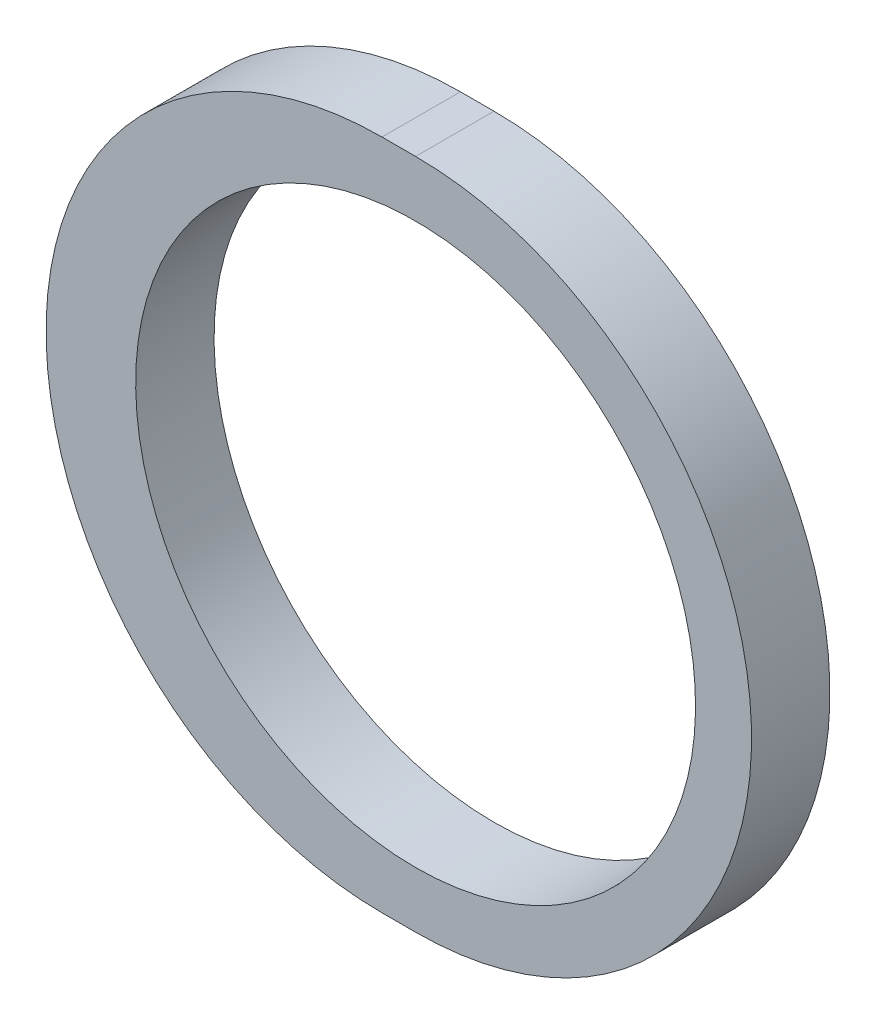
ISO-10303-21;
HEADER;
FILE_DESCRIPTION(('STEP AP214'),'2;1');
FILE_NAME('part.step','',(''),(''),'','','');
FILE_SCHEMA(('AUTOMOTIVE_DESIGN { 1 0 10303 214 1 1 1 1 }'));
ENDSEC;
DATA;
#1=APPLICATION_CONTEXT('core data for automotive mechanical design processes');
#2=APPLICATION_PROTOCOL_DEFINITION('international standard','automotive_design',2000,#1);
#3=PRODUCT_CONTEXT('',#1,'mechanical');
#4=PRODUCT('Part','Part','',(#3));
#5=PRODUCT_RELATED_PRODUCT_CATEGORY('part','',(#4));
#6=PRODUCT_DEFINITION_FORMATION('','',#4);
#7=PRODUCT_DEFINITION_CONTEXT('part definition',#1,'design');
#8=PRODUCT_DEFINITION('design','',#6,#7);
#9=PRODUCT_DEFINITION_SHAPE('','',#8);
#10=(LENGTH_UNIT() NAMED_UNIT(*) SI_UNIT(.MILLI.,.METRE.));
#11=(NAMED_UNIT(*) PLANE_ANGLE_UNIT() SI_UNIT($,.RADIAN.));
#12=(NAMED_UNIT(*) SI_UNIT($,.STERADIAN.) SOLID_ANGLE_UNIT());
#13=UNCERTAINTY_MEASURE_WITH_UNIT(LENGTH_MEASURE(1.E-05),#10,'distance_accuracy_value','');
#14=(GEOMETRIC_REPRESENTATION_CONTEXT(3) GLOBAL_UNCERTAINTY_ASSIGNED_CONTEXT((#13)) GLOBAL_UNIT_ASSIGNED_CONTEXT((#10,
#11,#12)) REPRESENTATION_CONTEXT('',''));
#15=CARTESIAN_POINT('',(0.,0.,0.));
#16=DIRECTION('',(0.,0.,1.));
#17=DIRECTION('',(1.,0.,0.));
#18=AXIS2_PLACEMENT_3D('',#15,#16,#17);
#19=CARTESIAN_POINT('',(90.9,-132.68,-0.045));
#20=DIRECTION('',(0.,0.,-1.));
#21=DIRECTION('',(0.,-1.,0.));
#22=AXIS2_PLACEMENT_3D('',#19,#20,#21);
#23=CYLINDRICAL_SURFACE('',#22,0.125);
#24=CARTESIAN_POINT('',(90.9,-132.68,-0.035));
#25=DIRECTION('',(0.,0.,-1.));
#26=DIRECTION('',(0.,-1.,0.));
#27=AXIS2_PLACEMENT_3D('',#24,#25,#26);
#28=CIRCLE('',#27,0.125);
#29=CARTESIAN_POINT('',(90.9,-132.805,-0.035));
#30=VERTEX_POINT('',#29);
#31=EDGE_CURVE('E122',#30,#30,#28,.T.);
#32=ORIENTED_EDGE('',*,*,#31,.T.);
#33=DIRECTION('',(0.,0.,1.));
#34=VECTOR('',#33,1.);
#35=CARTESIAN_POINT('',(90.9,-132.805,-0.045));
#36=LINE('',#35,#34);
#37=CARTESIAN_POINT('',(90.9,-132.805,0.));
#38=VERTEX_POINT('',#37);
#39=EDGE_CURVE('E11',#30,#38,#36,.T.);
#40=ORIENTED_EDGE('',*,*,#39,.T.);
#41=CARTESIAN_POINT('',(90.9,-132.68,0.));
#42=DIRECTION('',(0.,0.,-1.));
#43=DIRECTION('',(0.,-1.,0.));
#44=AXIS2_PLACEMENT_3D('',#41,#42,#43);
#45=CIRCLE('',#44,0.125);
#46=EDGE_CURVE('E26',#38,#38,#45,.T.);
#47=ORIENTED_EDGE('',*,*,#46,.F.);
#48=ORIENTED_EDGE('',*,*,#39,.F.);
#49=EDGE_LOOP('',(#32,#40,#47,#48));
#50=FACE_BOUND('',#49,.T.);
#51=ADVANCED_FACE('F17',(#50),#23,.F.);
#52=CARTESIAN_POINT('',(90.885,-132.83,-0.035));
#53=DIRECTION('',(0.,1.,0.));
#54=DIRECTION('',(1.,0.,0.));
#55=AXIS2_PLACEMENT_3D('',#52,#53,#54);
#56=PLANE('',#55);
#57=DIRECTION('',(1.,0.,0.));
#58=VECTOR('',#57,1.);
#59=CARTESIAN_POINT('',(90.885,-132.83,-0.035));
#60=LINE('',#59,#58);
#61=CARTESIAN_POINT('',(90.885,-132.83,-0.035));
#62=VERTEX_POINT('',#61);
#63=CARTESIAN_POINT('',(90.9,-132.83,-0.035));
#64=VERTEX_POINT('',#63);
#65=EDGE_CURVE('E59',#62,#64,#60,.T.);
#66=ORIENTED_EDGE('',*,*,#65,.T.);
#67=DIRECTION('',(0.,0.,1.));
#68=VECTOR('',#67,1.);
#69=CARTESIAN_POINT('',(90.9,-132.83,-0.035));
#70=LINE('',#69,#68);
#71=CARTESIAN_POINT('',(90.9,-132.83,0.));
#72=VERTEX_POINT('',#71);
#73=EDGE_CURVE('E91',#64,#72,#70,.T.);
#74=ORIENTED_EDGE('',*,*,#73,.T.);
#75=DIRECTION('',(1.,0.,0.));
#76=VECTOR('',#75,1.);
#77=CARTESIAN_POINT('',(90.885,-132.83,0.));
#78=LINE('',#77,#76);
#79=CARTESIAN_POINT('',(90.885,-132.83,0.));
#80=VERTEX_POINT('',#79);
#81=EDGE_CURVE('E49',#80,#72,#78,.T.);
#82=ORIENTED_EDGE('',*,*,#81,.F.);
#83=DIRECTION('',(0.,0.,1.));
#84=VECTOR('',#83,1.);
#85=CARTESIAN_POINT('',(90.885,-132.83,-0.035));
#86=LINE('',#85,#84);
#87=EDGE_CURVE('E126',#62,#80,#86,.T.);
#88=ORIENTED_EDGE('',*,*,#87,.F.);
#89=EDGE_LOOP('',(#66,#74,#82,#88));
#90=FACE_BOUND('',#89,.T.);
#91=ADVANCED_FACE('F155',(#90),#56,.F.);
#92=CARTESIAN_POINT('',(90.9,-132.53,0.));
#93=DIRECTION('',(0.,0.,1.));
#94=DIRECTION('',(1.,0.,0.));
#95=AXIS2_PLACEMENT_3D('',#92,#93,#94);
#96=PLANE('',#95);
#97=ORIENTED_EDGE('',*,*,#46,.T.);
#98=EDGE_LOOP('',(#97));
#99=FACE_BOUND('',#98,.T.);
#100=DIRECTION('',(-1.,0.,0.));
#101=VECTOR('',#100,1.);
#102=CARTESIAN_POINT('',(90.9,-132.53,0.));
#103=LINE('',#102,#101);
#104=CARTESIAN_POINT('',(90.9,-132.53,0.));
#105=VERTEX_POINT('',#104);
#106=CARTESIAN_POINT('',(90.885,-132.53,0.));
#107=VERTEX_POINT('',#106);
#108=EDGE_CURVE('E102',#105,#107,#103,.T.);
#109=ORIENTED_EDGE('',*,*,#108,.T.);
#110=CARTESIAN_POINT('',(90.885,-132.68,0.));
#111=DIRECTION('',(0.,0.,1.));
#112=DIRECTION('',(0.,1.,0.));
#113=AXIS2_PLACEMENT_3D('',#110,#111,#112);
#114=CIRCLE('',#113,0.15);
#115=EDGE_CURVE('E130',#107,#80,#114,.T.);
#116=ORIENTED_EDGE('',*,*,#115,.T.);
#117=ORIENTED_EDGE('',*,*,#81,.T.);
#118=CARTESIAN_POINT('',(90.9,-132.68,0.));
#119=DIRECTION('',(0.,0.,1.));
#120=DIRECTION('',(0.,-1.,0.));
#121=AXIS2_PLACEMENT_3D('',#118,#119,#120);
#122=CIRCLE('',#121,0.15);
#123=EDGE_CURVE('E94',#72,#105,#122,.T.);
#124=ORIENTED_EDGE('',*,*,#123,.T.);
#125=EDGE_LOOP('',(#109,#116,#117,#124));
#126=FACE_BOUND('',#125,.T.);
#127=ADVANCED_FACE('F145',(#99,#126),#96,.T.);
#128=CARTESIAN_POINT('',(90.9,-132.53,-0.035));
#129=DIRECTION('',(0.,0.,1.));
#130=DIRECTION('',(1.,0.,0.));
#131=AXIS2_PLACEMENT_3D('',#128,#129,#130);
#132=PLANE('',#131);
#133=ORIENTED_EDGE('',*,*,#31,.F.);
#134=EDGE_LOOP('',(#133));
#135=FACE_BOUND('',#134,.T.);
#136=CARTESIAN_POINT('',(90.9,-132.68,-0.035));
#137=DIRECTION('',(0.,0.,1.));
#138=DIRECTION('',(0.,-1.,0.));
#139=AXIS2_PLACEMENT_3D('',#136,#137,#138);
#140=CIRCLE('',#139,0.15);
#141=CARTESIAN_POINT('',(90.9,-132.53,-0.035));
#142=VERTEX_POINT('',#141);
#143=EDGE_CURVE('E85',#64,#142,#140,.T.);
#144=ORIENTED_EDGE('',*,*,#143,.F.);
#145=ORIENTED_EDGE('',*,*,#65,.F.);
#146=CARTESIAN_POINT('',(90.885,-132.68,-0.035));
#147=DIRECTION('',(0.,0.,1.));
#148=DIRECTION('',(0.,1.,0.));
#149=AXIS2_PLACEMENT_3D('',#146,#147,#148);
#150=CIRCLE('',#149,0.15);
#151=CARTESIAN_POINT('',(90.885,-132.53,-0.035));
#152=VERTEX_POINT('',#151);
#153=EDGE_CURVE('E107',#152,#62,#150,.T.);
#154=ORIENTED_EDGE('',*,*,#153,.F.);
#155=DIRECTION('',(-1.,0.,0.));
#156=VECTOR('',#155,1.);
#157=CARTESIAN_POINT('',(90.9,-132.53,-0.035));
#158=LINE('',#157,#156);
#159=EDGE_CURVE('E100',#142,#152,#158,.T.);
#160=ORIENTED_EDGE('',*,*,#159,.F.);
#161=EDGE_LOOP('',(#144,#145,#154,#160));
#162=FACE_BOUND('',#161,.T.);
#163=ADVANCED_FACE('F105',(#135,#162),#132,.F.);
#164=CARTESIAN_POINT('',(90.885,-132.68,-0.035));
#165=DIRECTION('',(0.,0.,-1.));
#166=DIRECTION('',(0.,1.,0.));
#167=AXIS2_PLACEMENT_3D('',#164,#165,#166);
#168=CYLINDRICAL_SURFACE('',#167,0.15);
#169=ORIENTED_EDGE('',*,*,#153,.T.);
#170=ORIENTED_EDGE('',*,*,#87,.T.);
#171=ORIENTED_EDGE('',*,*,#115,.F.);
#172=DIRECTION('',(0.,0.,1.));
#173=VECTOR('',#172,1.);
#174=CARTESIAN_POINT('',(90.885,-132.53,-0.035));
#175=LINE('',#174,#173);
#176=EDGE_CURVE('E110',#152,#107,#175,.T.);
#177=ORIENTED_EDGE('',*,*,#176,.F.);
#178=EDGE_LOOP('',(#169,#170,#171,#177));
#179=FACE_BOUND('',#178,.T.);
#180=ADVANCED_FACE('F144',(#179),#168,.T.);
#181=CARTESIAN_POINT('',(90.9,-132.68,-0.035));
#182=DIRECTION('',(0.,0.,-1.));
#183=DIRECTION('',(0.,-1.,0.));
#184=AXIS2_PLACEMENT_3D('',#181,#182,#183);
#185=CYLINDRICAL_SURFACE('',#184,0.15);
#186=ORIENTED_EDGE('',*,*,#143,.T.);
#187=DIRECTION('',(0.,0.,1.));
#188=VECTOR('',#187,1.);
#189=CARTESIAN_POINT('',(90.9,-132.53,-0.035));
#190=LINE('',#189,#188);
#191=EDGE_CURVE('E89',#142,#105,#190,.T.);
#192=ORIENTED_EDGE('',*,*,#191,.T.);
#193=ORIENTED_EDGE('',*,*,#123,.F.);
#194=ORIENTED_EDGE('',*,*,#73,.F.);
#195=EDGE_LOOP('',(#186,#192,#193,#194));
#196=FACE_BOUND('',#195,.T.);
#197=ADVANCED_FACE('F87',(#196),#185,.T.);
#198=CARTESIAN_POINT('',(90.9,-132.53,-0.035));
#199=DIRECTION('',(0.,-1.,0.));
#200=DIRECTION('',(0.,0.,-1.));
#201=AXIS2_PLACEMENT_3D('',#198,#199,#200);
#202=PLANE('',#201);
#203=ORIENTED_EDGE('',*,*,#159,.T.);
#204=ORIENTED_EDGE('',*,*,#176,.T.);
#205=ORIENTED_EDGE('',*,*,#108,.F.);
#206=ORIENTED_EDGE('',*,*,#191,.F.);
#207=EDGE_LOOP('',(#203,#204,#205,#206));
#208=FACE_BOUND('',#207,.T.);
#209=ADVANCED_FACE('F98',(#208),#202,.F.);
#210=CLOSED_SHELL('',(#51,#91,#127,#163,#180,#197,#209));
#211=MANIFOLD_SOLID_BREP('B1',#210);
#212=ADVANCED_BREP_SHAPE_REPRESENTATION('',(#18,#211),#14);
#213=SHAPE_DEFINITION_REPRESENTATION(#9,#212);
ENDSEC;
END-ISO-10303-21;
